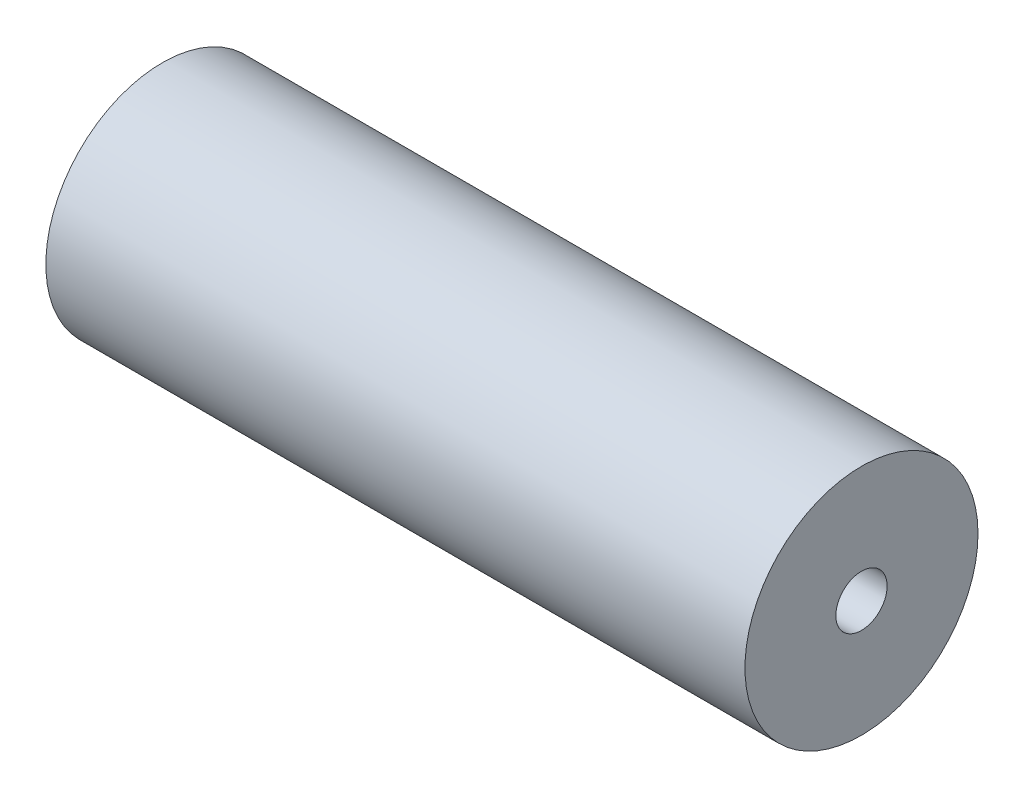
ISO-10303-21;
HEADER;
FILE_DESCRIPTION(('STEP AP214'),'2;1');
FILE_NAME('part.step','',(''),(''),'','','');
FILE_SCHEMA(('AUTOMOTIVE_DESIGN { 1 0 10303 214 1 1 1 1 }'));
ENDSEC;
DATA;
#1=APPLICATION_CONTEXT('core data for automotive mechanical design processes');
#2=APPLICATION_PROTOCOL_DEFINITION('international standard','automotive_design',2000,#1);
#3=PRODUCT_CONTEXT('',#1,'mechanical');
#4=PRODUCT('Part','Part','',(#3));
#5=PRODUCT_RELATED_PRODUCT_CATEGORY('part','',(#4));
#6=PRODUCT_DEFINITION_FORMATION('','',#4);
#7=PRODUCT_DEFINITION_CONTEXT('part definition',#1,'design');
#8=PRODUCT_DEFINITION('design','',#6,#7);
#9=PRODUCT_DEFINITION_SHAPE('','',#8);
#10=(LENGTH_UNIT() NAMED_UNIT(*) SI_UNIT(.MILLI.,.METRE.));
#11=(NAMED_UNIT(*) PLANE_ANGLE_UNIT() SI_UNIT($,.RADIAN.));
#12=(NAMED_UNIT(*) SI_UNIT($,.STERADIAN.) SOLID_ANGLE_UNIT());
#13=UNCERTAINTY_MEASURE_WITH_UNIT(LENGTH_MEASURE(1.E-05),#10,'distance_accuracy_value','');
#14=(GEOMETRIC_REPRESENTATION_CONTEXT(3) GLOBAL_UNCERTAINTY_ASSIGNED_CONTEXT((#13)) GLOBAL_UNIT_ASSIGNED_CONTEXT((#10,
#11,#12)) REPRESENTATION_CONTEXT('',''));
#15=CARTESIAN_POINT('',(0.,0.,0.));
#16=DIRECTION('',(0.,0.,1.));
#17=DIRECTION('',(1.,0.,0.));
#18=AXIS2_PLACEMENT_3D('',#15,#16,#17);
#19=CARTESIAN_POINT('',(60.,0.,0.));
#20=DIRECTION('',(-1.,0.,0.));
#21=DIRECTION('',(0.,0.,1.));
#22=AXIS2_PLACEMENT_3D('',#19,#20,#21);
#23=CYLINDRICAL_SURFACE('',#22,10.);
#24=CARTESIAN_POINT('',(60.,0.,0.));
#25=DIRECTION('',(1.,0.,0.));
#26=DIRECTION('',(0.,0.,-1.));
#27=AXIS2_PLACEMENT_3D('',#24,#25,#26);
#28=CIRCLE('',#27,10.);
#29=CARTESIAN_POINT('',(60.,0.,-10.));
#30=VERTEX_POINT('',#29);
#31=EDGE_CURVE('E10',#30,#30,#28,.T.);
#32=ORIENTED_EDGE('',*,*,#31,.F.);
#33=EDGE_LOOP('',(#32));
#34=FACE_BOUND('',#33,.T.);
#35=CARTESIAN_POINT('',(0.,0.,0.));
#36=DIRECTION('',(1.,0.,0.));
#37=DIRECTION('',(0.,0.,-1.));
#38=AXIS2_PLACEMENT_3D('',#35,#36,#37);
#39=CIRCLE('',#38,10.);
#40=CARTESIAN_POINT('',(0.,0.,-10.));
#41=VERTEX_POINT('',#40);
#42=EDGE_CURVE('E36',#41,#41,#39,.T.);
#43=ORIENTED_EDGE('',*,*,#42,.T.);
#44=EDGE_LOOP('',(#43));
#45=FACE_BOUND('',#44,.T.);
#46=ADVANCED_FACE('F33',(#34,#45),#23,.T.);
#47=CARTESIAN_POINT('',(60.,0.,0.));
#48=DIRECTION('',(1.,0.,0.));
#49=DIRECTION('',(0.,0.,-1.));
#50=AXIS2_PLACEMENT_3D('',#47,#48,#49);
#51=PLANE('',#50);
#52=CARTESIAN_POINT('',(60.,0.,0.));
#53=DIRECTION('',(-1.,0.,0.));
#54=DIRECTION('',(0.,0.,1.));
#55=AXIS2_PLACEMENT_3D('',#52,#53,#54);
#56=CIRCLE('',#55,2.2);
#57=CARTESIAN_POINT('',(60.,0.,2.2));
#58=VERTEX_POINT('',#57);
#59=EDGE_CURVE('E43',#58,#58,#56,.T.);
#60=ORIENTED_EDGE('',*,*,#59,.T.);
#61=EDGE_LOOP('',(#60));
#62=FACE_BOUND('',#61,.T.);
#63=ORIENTED_EDGE('',*,*,#31,.T.);
#64=EDGE_LOOP('',(#63));
#65=FACE_BOUND('',#64,.T.);
#66=ADVANCED_FACE('F51',(#62,#65),#51,.T.);
#67=CARTESIAN_POINT('',(0.,0.,0.));
#68=DIRECTION('',(1.,0.,0.));
#69=DIRECTION('',(0.,0.,-1.));
#70=AXIS2_PLACEMENT_3D('',#67,#68,#69);
#71=PLANE('',#70);
#72=CARTESIAN_POINT('',(0.,0.,0.));
#73=DIRECTION('',(-1.,0.,0.));
#74=DIRECTION('',(0.,0.,1.));
#75=AXIS2_PLACEMENT_3D('',#72,#73,#74);
#76=CIRCLE('',#75,2.2);
#77=CARTESIAN_POINT('',(0.,0.,2.2));
#78=VERTEX_POINT('',#77);
#79=EDGE_CURVE('E45',#78,#78,#76,.T.);
#80=ORIENTED_EDGE('',*,*,#79,.F.);
#81=EDGE_LOOP('',(#80));
#82=FACE_BOUND('',#81,.T.);
#83=ORIENTED_EDGE('',*,*,#42,.F.);
#84=EDGE_LOOP('',(#83));
#85=FACE_BOUND('',#84,.T.);
#86=ADVANCED_FACE('F56',(#82,#85),#71,.F.);
#87=CARTESIAN_POINT('',(60.,0.,0.));
#88=DIRECTION('',(-1.,0.,0.));
#89=DIRECTION('',(0.,0.,1.));
#90=AXIS2_PLACEMENT_3D('',#87,#88,#89);
#91=CYLINDRICAL_SURFACE('',#90,2.2);
#92=ORIENTED_EDGE('',*,*,#59,.F.);
#93=EDGE_LOOP('',(#92));
#94=FACE_BOUND('',#93,.T.);
#95=ORIENTED_EDGE('',*,*,#79,.T.);
#96=EDGE_LOOP('',(#95));
#97=FACE_BOUND('',#96,.T.);
#98=ADVANCED_FACE('F53',(#94,#97),#91,.F.);
#99=CLOSED_SHELL('',(#46,#66,#86,#98));
#100=MANIFOLD_SOLID_BREP('B2',#99);
#101=ADVANCED_BREP_SHAPE_REPRESENTATION('',(#18,#100),#14);
#102=SHAPE_DEFINITION_REPRESENTATION(#9,#101);
ENDSEC;
END-ISO-10303-21;
